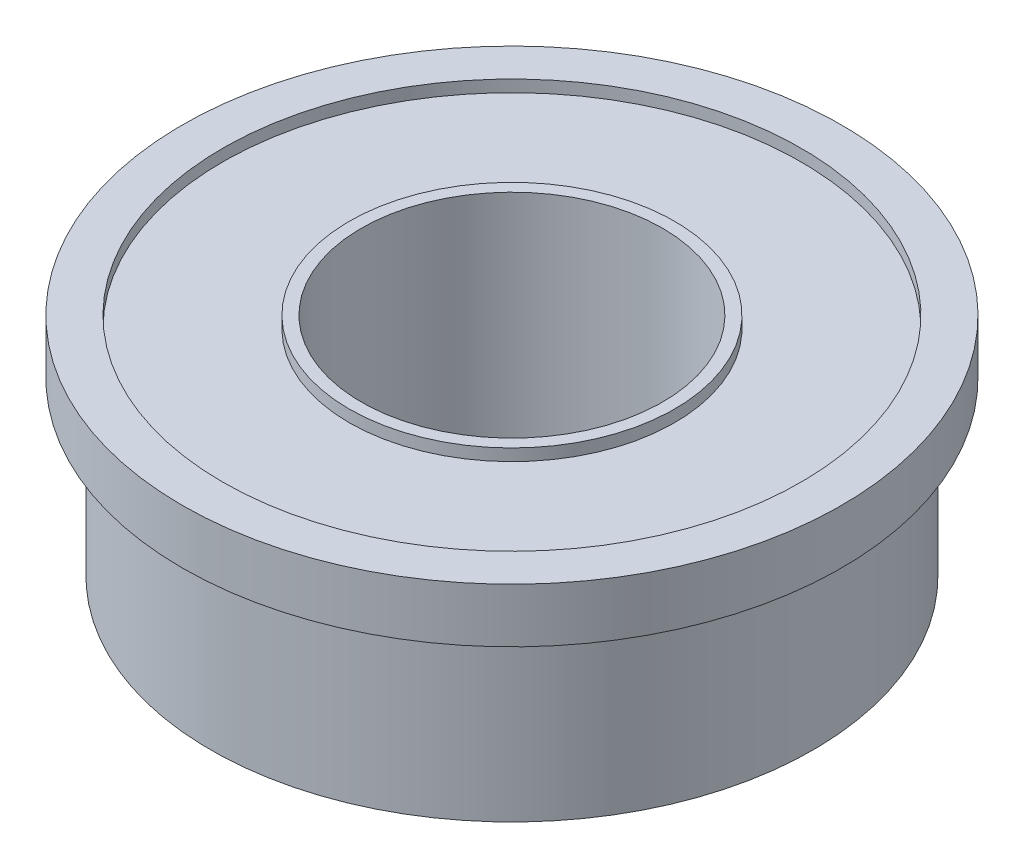
ISO-10303-21;
HEADER;
FILE_DESCRIPTION(('STEP AP214'),'2;1');
FILE_NAME('part.step','',(''),(''),'','','');
FILE_SCHEMA(('AUTOMOTIVE_DESIGN { 1 0 10303 214 1 1 1 1 }'));
ENDSEC;
DATA;
#1=APPLICATION_CONTEXT('core data for automotive mechanical design processes');
#2=APPLICATION_PROTOCOL_DEFINITION('international standard','automotive_design',2000,#1);
#3=PRODUCT_CONTEXT('',#1,'mechanical');
#4=PRODUCT('Part','Part','',(#3));
#5=PRODUCT_RELATED_PRODUCT_CATEGORY('part','',(#4));
#6=PRODUCT_DEFINITION_FORMATION('','',#4);
#7=PRODUCT_DEFINITION_CONTEXT('part definition',#1,'design');
#8=PRODUCT_DEFINITION('design','',#6,#7);
#9=PRODUCT_DEFINITION_SHAPE('','',#8);
#10=(LENGTH_UNIT() NAMED_UNIT(*) SI_UNIT(.MILLI.,.METRE.));
#11=(NAMED_UNIT(*) PLANE_ANGLE_UNIT() SI_UNIT($,.RADIAN.));
#12=(NAMED_UNIT(*) SI_UNIT($,.STERADIAN.) SOLID_ANGLE_UNIT());
#13=UNCERTAINTY_MEASURE_WITH_UNIT(LENGTH_MEASURE(1.E-05),#10,'distance_accuracy_value','');
#14=(GEOMETRIC_REPRESENTATION_CONTEXT(3) GLOBAL_UNCERTAINTY_ASSIGNED_CONTEXT((#13)) GLOBAL_UNIT_ASSIGNED_CONTEXT((#10,
#11,#12)) REPRESENTATION_CONTEXT('',''));
#15=CARTESIAN_POINT('',(0.,0.,0.));
#16=DIRECTION('',(0.,0.,1.));
#17=DIRECTION('',(1.,0.,0.));
#18=AXIS2_PLACEMENT_3D('',#15,#16,#17);
#19=CARTESIAN_POINT('',(0.,4.7625,0.));
#20=DIRECTION('',(0.,-1.,0.));
#21=DIRECTION('',(0.,0.,-1.));
#22=AXIS2_PLACEMENT_3D('',#19,#20,#21);
#23=CYLINDRICAL_SURFACE('',#22,6.35);
#24=CARTESIAN_POINT('',(0.,0.,0.));
#25=DIRECTION('',(0.,1.,0.));
#26=DIRECTION('',(0.,0.,1.));
#27=AXIS2_PLACEMENT_3D('',#24,#25,#26);
#28=CIRCLE('',#27,6.35);
#29=CARTESIAN_POINT('',(0.,0.,-6.35));
#30=VERTEX_POINT('',#29);
#31=EDGE_CURVE('E39',#30,#30,#28,.T.);
#32=CARTESIAN_POINT('',(0.,3.6195,0.));
#33=DIRECTION('',(0.,1.,0.));
#34=DIRECTION('',(0.,0.,1.));
#35=AXIS2_PLACEMENT_3D('',#32,#33,#34);
#36=CIRCLE('',#35,6.35);
#37=CARTESIAN_POINT('',(0.,3.6195,-6.35));
#38=VERTEX_POINT('',#37);
#39=EDGE_CURVE('E10',#38,#38,#36,.T.);
#40=CARTESIAN_POINT('',(0.,0.,-6.35));
#41=CARTESIAN_POINT('',(0.,0.037703125,-6.35));
#42=CARTESIAN_POINT('',(0.,0.07540625,-6.35));
#43=CARTESIAN_POINT('',(0.,0.1508125,-6.35));
#44=CARTESIAN_POINT('',(0.,0.188515625,-6.35));
#45=CARTESIAN_POINT('',(0.,0.263921875,-6.35));
#46=CARTESIAN_POINT('',(0.,0.301625,-6.35));
#47=CARTESIAN_POINT('',(0.,0.37703125,-6.35));
#48=CARTESIAN_POINT('',(0.,0.414734375,-6.35));
#49=CARTESIAN_POINT('',(0.,0.490140625,-6.35));
#50=CARTESIAN_POINT('',(0.,0.52784375,-6.35));
#51=CARTESIAN_POINT('',(0.,0.60325,-6.35));
#52=CARTESIAN_POINT('',(0.,0.640953125,-6.35));
#53=CARTESIAN_POINT('',(0.,0.716359375,-6.35));
#54=CARTESIAN_POINT('',(0.,0.7540625,-6.35));
#55=CARTESIAN_POINT('',(0.,0.82946875,-6.35));
#56=CARTESIAN_POINT('',(0.,0.867171875,-6.35));
#57=CARTESIAN_POINT('',(0.,0.942578125,-6.35));
#58=CARTESIAN_POINT('',(0.,0.98028125,-6.35));
#59=CARTESIAN_POINT('',(0.,1.0556875,-6.35));
#60=CARTESIAN_POINT('',(0.,1.093390625,-6.35));
#61=CARTESIAN_POINT('',(0.,1.168796875,-6.35));
#62=CARTESIAN_POINT('',(0.,1.2065,-6.35));
#63=CARTESIAN_POINT('',(0.,1.28190625,-6.35));
#64=CARTESIAN_POINT('',(0.,1.319609375,-6.35));
#65=CARTESIAN_POINT('',(0.,1.395015625,-6.35));
#66=CARTESIAN_POINT('',(0.,1.43271875,-6.35));
#67=CARTESIAN_POINT('',(0.,1.508125,-6.35));
#68=CARTESIAN_POINT('',(0.,1.545828125,-6.35));
#69=CARTESIAN_POINT('',(0.,1.621234375,-6.35));
#70=CARTESIAN_POINT('',(0.,1.6589375,-6.35));
#71=CARTESIAN_POINT('',(0.,1.73434375,-6.35));
#72=CARTESIAN_POINT('',(0.,1.772046875,-6.35));
#73=CARTESIAN_POINT('',(0.,1.847453125,-6.35));
#74=CARTESIAN_POINT('',(0.,1.88515625,-6.35));
#75=CARTESIAN_POINT('',(0.,1.9605625,-6.35));
#76=CARTESIAN_POINT('',(0.,1.998265625,-6.35));
#77=CARTESIAN_POINT('',(0.,2.073671875,-6.35));
#78=CARTESIAN_POINT('',(0.,2.111375,-6.35));
#79=CARTESIAN_POINT('',(0.,2.18678125,-6.35));
#80=CARTESIAN_POINT('',(0.,2.224484375,-6.35));
#81=CARTESIAN_POINT('',(0.,2.299890625,-6.35));
#82=CARTESIAN_POINT('',(0.,2.33759375,-6.35));
#83=CARTESIAN_POINT('',(0.,2.413,-6.35));
#84=CARTESIAN_POINT('',(0.,2.450703125,-6.35));
#85=CARTESIAN_POINT('',(0.,2.526109375,-6.35));
#86=CARTESIAN_POINT('',(0.,2.5638125,-6.35));
#87=CARTESIAN_POINT('',(0.,2.63921875,-6.35));
#88=CARTESIAN_POINT('',(0.,2.676921875,-6.35));
#89=CARTESIAN_POINT('',(0.,2.752328125,-6.35));
#90=CARTESIAN_POINT('',(0.,2.79003125,-6.35));
#91=CARTESIAN_POINT('',(0.,2.8654375,-6.35));
#92=CARTESIAN_POINT('',(0.,2.903140625,-6.35));
#93=CARTESIAN_POINT('',(0.,2.978546875,-6.35));
#94=CARTESIAN_POINT('',(0.,3.01625,-6.35));
#95=CARTESIAN_POINT('',(0.,3.09165625,-6.35));
#96=CARTESIAN_POINT('',(0.,3.129359375,-6.35));
#97=CARTESIAN_POINT('',(0.,3.204765625,-6.35));
#98=CARTESIAN_POINT('',(0.,3.24246875,-6.35));
#99=CARTESIAN_POINT('',(0.,3.317875,-6.35));
#100=CARTESIAN_POINT('',(0.,3.355578125,-6.35));
#101=CARTESIAN_POINT('',(0.,3.430984375,-6.35));
#102=CARTESIAN_POINT('',(0.,3.4686875,-6.35));
#103=CARTESIAN_POINT('',(0.,3.54409375,-6.35));
#104=CARTESIAN_POINT('',(0.,3.581796875,-6.35));
#105=CARTESIAN_POINT('',(0.,3.6195,-6.35));
#106=B_SPLINE_CURVE_WITH_KNOTS('',3,(#40,#41,#42,#43,#44,#45,#46,#47,#48,#49,#50,#51,#52,#53,
#54,#55,#56,#57,#58,#59,#60,#61,#62,#63,#64,#65,#66,#67,#68,#69,#70,#71,#72,#73,#74,#75,#76,#77,
#78,#79,#80,#81,#82,#83,#84,#85,#86,#87,#88,#89,#90,#91,#92,#93,#94,#95,#96,#97,#98,#99,#100,
#101,#102,#103,#104,#105),.UNSPECIFIED.,.F.,.F.,(4,2,2,2,2,2,2,2,2,2,2,2,2,2,2,2,2,2,2,2,2,2,2,
2,2,2,2,2,2,2,2,2,4),(0.,0.113109375,0.22621875,0.339328125,0.4524375,0.565546875,0.67865625,
0.791765625,0.904875,1.017984375,1.13109375,1.244203125,1.3573125,1.470421875,1.58353125,
1.696640625,1.80975,1.922859375,2.03596875,2.149078125,2.2621875,2.375296875,2.48840625,
2.601515625,2.714625,2.827734375,2.94084375,3.053953125,3.1670625,3.280171875,3.39328125,
3.506390625,3.6195),.UNSPECIFIED.);
#107=EDGE_CURVE('BSEAM33',#30,#38,#106,.T.);
#108=ORIENTED_EDGE('',*,*,#31,.T.);
#109=ORIENTED_EDGE('',*,*,#39,.F.);
#110=ORIENTED_EDGE('',*,*,#107,.T.);
#111=ORIENTED_EDGE('',*,*,#107,.F.);
#112=EDGE_LOOP('',(#108,#110,#109,#111));
#113=FACE_BOUND('',#112,.T.);
#114=ADVANCED_FACE('F33',(#113),#23,.T.);
#115=CARTESIAN_POINT('',(0.,0.,0.));
#116=DIRECTION('',(0.,1.,0.));
#117=DIRECTION('',(0.,0.,1.));
#118=AXIS2_PLACEMENT_3D('',#115,#116,#117);
#119=PLANE('',#118);
#120=CARTESIAN_POINT('',(0.,0.,0.));
#121=DIRECTION('',(0.,1.,0.));
#122=DIRECTION('',(0.,0.,1.));
#123=AXIS2_PLACEMENT_3D('',#120,#121,#122);
#124=CIRCLE('',#123,3.175);
#125=CARTESIAN_POINT('',(0.,0.,-3.175));
#126=VERTEX_POINT('',#125);
#127=EDGE_CURVE('E47',#126,#126,#124,.T.);
#128=ORIENTED_EDGE('',*,*,#127,.T.);
#129=EDGE_LOOP('',(#128));
#130=FACE_BOUND('',#129,.T.);
#131=CARTESIAN_POINT('',(0.,0.,0.));
#132=DIRECTION('',(0.,1.,0.));
#133=DIRECTION('',(0.,0.,1.));
#134=AXIS2_PLACEMENT_3D('',#131,#132,#133);
#135=CIRCLE('',#134,3.429);
#136=CARTESIAN_POINT('',(0.,0.,3.429));
#137=VERTEX_POINT('',#136);
#138=EDGE_CURVE('E71',#137,#137,#135,.T.);
#139=ORIENTED_EDGE('',*,*,#138,.F.);
#140=EDGE_LOOP('',(#139));
#141=FACE_BOUND('',#140,.T.);
#142=ADVANCED_FACE('F95',(#130,#141),#119,.F.);
#143=CARTESIAN_POINT('',(0.,4.7625,0.));
#144=DIRECTION('',(0.,1.,0.));
#145=DIRECTION('',(0.,0.,1.));
#146=AXIS2_PLACEMENT_3D('',#143,#144,#145);
#147=PLANE('',#146);
#148=CARTESIAN_POINT('',(0.,4.7625,0.));
#149=DIRECTION('',(0.,1.,0.));
#150=DIRECTION('',(0.,0.,1.));
#151=AXIS2_PLACEMENT_3D('',#148,#149,#150);
#152=CIRCLE('',#151,3.175);
#153=CARTESIAN_POINT('',(0.,4.7625,-3.175));
#154=VERTEX_POINT('',#153);
#155=EDGE_CURVE('E43',#154,#154,#152,.T.);
#156=ORIENTED_EDGE('',*,*,#155,.F.);
#157=EDGE_LOOP('',(#156));
#158=FACE_BOUND('',#157,.T.);
#159=CARTESIAN_POINT('',(0.,4.7625,0.));
#160=DIRECTION('',(0.,1.,0.));
#161=DIRECTION('',(0.,0.,1.));
#162=AXIS2_PLACEMENT_3D('',#159,#160,#161);
#163=CIRCLE('',#162,3.429);
#164=CARTESIAN_POINT('',(0.,4.7625,3.429));
#165=VERTEX_POINT('',#164);
#166=EDGE_CURVE('E59',#165,#165,#163,.T.);
#167=ORIENTED_EDGE('',*,*,#166,.T.);
#168=EDGE_LOOP('',(#167));
#169=FACE_BOUND('',#168,.T.);
#170=ADVANCED_FACE('F99',(#158,#169),#147,.T.);
#171=CARTESIAN_POINT('',(0.,4.7625,0.));
#172=DIRECTION('',(0.,1.,0.));
#173=DIRECTION('',(0.,0.,1.));
#174=AXIS2_PLACEMENT_3D('',#171,#172,#173);
#175=CIRCLE('',#174,6.096);
#176=CARTESIAN_POINT('',(0.,4.7625,6.096));
#177=VERTEX_POINT('',#176);
#178=EDGE_CURVE('E53',#177,#177,#175,.T.);
#179=ORIENTED_EDGE('',*,*,#178,.F.);
#180=EDGE_LOOP('',(#179));
#181=FACE_BOUND('',#180,.T.);
#182=CARTESIAN_POINT('',(0.,4.7625,0.));
#183=DIRECTION('',(0.,1.,0.));
#184=DIRECTION('',(0.,0.,1.));
#185=AXIS2_PLACEMENT_3D('',#182,#183,#184);
#186=CIRCLE('',#185,6.9469);
#187=CARTESIAN_POINT('',(0.,4.7625,6.9469));
#188=VERTEX_POINT('',#187);
#189=EDGE_CURVE('E77',#188,#188,#186,.T.);
#190=ORIENTED_EDGE('',*,*,#189,.T.);
#191=EDGE_LOOP('',(#190));
#192=FACE_BOUND('',#191,.T.);
#193=ADVANCED_FACE('F106',(#181,#192),#147,.T.);
#194=CARTESIAN_POINT('',(0.,0.,0.));
#195=DIRECTION('',(0.,1.,0.));
#196=DIRECTION('',(0.,0.,1.));
#197=AXIS2_PLACEMENT_3D('',#194,#195,#196);
#198=CIRCLE('',#197,6.096);
#199=CARTESIAN_POINT('',(0.,0.,6.096));
#200=VERTEX_POINT('',#199);
#201=EDGE_CURVE('E65',#200,#200,#198,.T.);
#202=ORIENTED_EDGE('',*,*,#201,.T.);
#203=EDGE_LOOP('',(#202));
#204=FACE_BOUND('',#203,.T.);
#205=ORIENTED_EDGE('',*,*,#31,.F.);
#206=EDGE_LOOP('',(#205));
#207=FACE_BOUND('',#206,.T.);
#208=ADVANCED_FACE('F101',(#204,#207),#119,.F.);
#209=CARTESIAN_POINT('',(0.,4.7625,0.));
#210=DIRECTION('',(0.,-1.,0.));
#211=DIRECTION('',(0.,0.,-1.));
#212=AXIS2_PLACEMENT_3D('',#209,#210,#211);
#213=CYLINDRICAL_SURFACE('',#212,3.175);
#214=CARTESIAN_POINT('',(0.,4.7625,-3.175));
#215=CARTESIAN_POINT('',(0.,4.712890625,-3.175));
#216=CARTESIAN_POINT('',(0.,4.66328125,-3.175));
#217=CARTESIAN_POINT('',(0.,4.5640625,-3.175));
#218=CARTESIAN_POINT('',(0.,4.514453125,-3.175));
#219=CARTESIAN_POINT('',(0.,4.415234375,-3.175));
#220=CARTESIAN_POINT('',(0.,4.365625,-3.175));
#221=CARTESIAN_POINT('',(0.,4.26640625,-3.175));
#222=CARTESIAN_POINT('',(0.,4.216796875,-3.175));
#223=CARTESIAN_POINT('',(0.,4.117578125,-3.175));
#224=CARTESIAN_POINT('',(0.,4.06796875,-3.175));
#225=CARTESIAN_POINT('',(0.,3.96875,-3.175));
#226=CARTESIAN_POINT('',(0.,3.919140625,-3.175));
#227=CARTESIAN_POINT('',(0.,3.819921875,-3.175));
#228=CARTESIAN_POINT('',(0.,3.7703125,-3.175));
#229=CARTESIAN_POINT('',(0.,3.67109375,-3.175));
#230=CARTESIAN_POINT('',(0.,3.621484375,-3.175));
#231=CARTESIAN_POINT('',(0.,3.522265625,-3.175));
#232=CARTESIAN_POINT('',(0.,3.47265625,-3.175));
#233=CARTESIAN_POINT('',(0.,3.3734375,-3.175));
#234=CARTESIAN_POINT('',(0.,3.323828125,-3.175));
#235=CARTESIAN_POINT('',(0.,3.224609375,-3.175));
#236=CARTESIAN_POINT('',(0.,3.175,-3.175));
#237=CARTESIAN_POINT('',(0.,3.07578125,-3.175));
#238=CARTESIAN_POINT('',(0.,3.026171875,-3.175));
#239=CARTESIAN_POINT('',(0.,2.926953125,-3.175));
#240=CARTESIAN_POINT('',(0.,2.87734375,-3.175));
#241=CARTESIAN_POINT('',(0.,2.778125,-3.175));
#242=CARTESIAN_POINT('',(0.,2.728515625,-3.175));
#243=CARTESIAN_POINT('',(0.,2.629296875,-3.175));
#244=CARTESIAN_POINT('',(0.,2.5796875,-3.175));
#245=CARTESIAN_POINT('',(0.,2.48046875,-3.175));
#246=CARTESIAN_POINT('',(0.,2.430859375,-3.175));
#247=CARTESIAN_POINT('',(0.,2.331640625,-3.175));
#248=CARTESIAN_POINT('',(0.,2.28203125,-3.175));
#249=CARTESIAN_POINT('',(0.,2.1828125,-3.175));
#250=CARTESIAN_POINT('',(0.,2.133203125,-3.175));
#251=CARTESIAN_POINT('',(0.,2.033984375,-3.175));
#252=CARTESIAN_POINT('',(0.,1.984375,-3.175));
#253=CARTESIAN_POINT('',(0.,1.88515625,-3.175));
#254=CARTESIAN_POINT('',(0.,1.835546875,-3.175));
#255=CARTESIAN_POINT('',(0.,1.736328125,-3.175));
#256=CARTESIAN_POINT('',(0.,1.68671875,-3.175));
#257=CARTESIAN_POINT('',(0.,1.5875,-3.175));
#258=CARTESIAN_POINT('',(0.,1.537890625,-3.175));
#259=CARTESIAN_POINT('',(0.,1.438671875,-3.175));
#260=CARTESIAN_POINT('',(0.,1.3890625,-3.175));
#261=CARTESIAN_POINT('',(0.,1.28984375,-3.175));
#262=CARTESIAN_POINT('',(0.,1.240234375,-3.175));
#263=CARTESIAN_POINT('',(0.,1.141015625,-3.175));
#264=CARTESIAN_POINT('',(0.,1.09140625,-3.175));
#265=CARTESIAN_POINT('',(0.,0.9921875,-3.175));
#266=CARTESIAN_POINT('',(0.,0.942578125,-3.175));
#267=CARTESIAN_POINT('',(0.,0.843359375,-3.175));
#268=CARTESIAN_POINT('',(0.,0.79375,-3.175));
#269=CARTESIAN_POINT('',(0.,0.69453125,-3.175));
#270=CARTESIAN_POINT('',(0.,0.644921875,-3.175));
#271=CARTESIAN_POINT('',(0.,0.545703125,-3.175));
#272=CARTESIAN_POINT('',(0.,0.49609375,-3.175));
#273=CARTESIAN_POINT('',(0.,0.396875,-3.175));
#274=CARTESIAN_POINT('',(0.,0.347265625,-3.175));
#275=CARTESIAN_POINT('',(0.,0.248046875,-3.175));
#276=CARTESIAN_POINT('',(0.,0.1984375,-3.175));
#277=CARTESIAN_POINT('',(0.,0.09921875,-3.175));
#278=CARTESIAN_POINT('',(0.,0.049609375,-3.175));
#279=CARTESIAN_POINT('',(0.,0.,-3.175));
#280=B_SPLINE_CURVE_WITH_KNOTS('',3,(#214,#215,#216,#217,#218,#219,#220,#221,#222,#223,#224,
#225,#226,#227,#228,#229,#230,#231,#232,#233,#234,#235,#236,#237,#238,#239,#240,#241,#242,#243,
#244,#245,#246,#247,#248,#249,#250,#251,#252,#253,#254,#255,#256,#257,#258,#259,#260,#261,#262,
#263,#264,#265,#266,#267,#268,#269,#270,#271,#272,#273,#274,#275,#276,#277,#278,#279),
.UNSPECIFIED.,.F.,.F.,(4,2,2,2,2,2,2,2,2,2,2,2,2,2,2,2,2,2,2,2,2,2,2,2,2,2,2,2,2,2,2,2,4),(0.,
0.148828124999999,0.297656249999999,0.446484374999999,0.595312499999999,0.744140625,0.89296875,
1.041796875,1.190625,1.339453125,1.48828125,1.637109375,1.7859375,1.934765625,2.08359375,
2.232421875,2.38125,2.530078125,2.67890625,2.827734375,2.9765625,3.125390625,3.27421875,
3.423046875,3.571875,3.720703125,3.86953125,4.018359375,4.1671875,4.316015625,4.46484375,
4.613671875,4.7625),.UNSPECIFIED.);
#281=EDGE_CURVE('BSEAM111',#154,#126,#280,.T.);
#282=ORIENTED_EDGE('',*,*,#155,.T.);
#283=ORIENTED_EDGE('',*,*,#127,.F.);
#284=ORIENTED_EDGE('',*,*,#281,.T.);
#285=ORIENTED_EDGE('',*,*,#281,.F.);
#286=EDGE_LOOP('',(#282,#284,#283,#285));
#287=FACE_BOUND('',#286,.T.);
#288=ADVANCED_FACE('F111',(#287),#213,.F.);
#289=CARTESIAN_POINT('',(0.,4.5125,0.));
#290=DIRECTION('',(0.,1.,0.));
#291=DIRECTION('',(0.,0.,1.));
#292=AXIS2_PLACEMENT_3D('',#289,#290,#291);
#293=CYLINDRICAL_SURFACE('',#292,6.096);
#294=CARTESIAN_POINT('',(0.,4.5125,0.));
#295=DIRECTION('',(0.,1.,0.));
#296=DIRECTION('',(0.,0.,1.));
#297=AXIS2_PLACEMENT_3D('',#294,#295,#296);
#298=CIRCLE('',#297,6.096);
#299=CARTESIAN_POINT('',(0.,4.5125,6.096));
#300=VERTEX_POINT('',#299);
#301=EDGE_CURVE('E51',#300,#300,#298,.T.);
#302=ORIENTED_EDGE('',*,*,#301,.F.);
#303=EDGE_LOOP('',(#302));
#304=FACE_BOUND('',#303,.T.);
#305=ORIENTED_EDGE('',*,*,#178,.T.);
#306=EDGE_LOOP('',(#305));
#307=FACE_BOUND('',#306,.T.);
#308=ADVANCED_FACE('F117',(#304,#307),#293,.F.);
#309=CARTESIAN_POINT('',(0.,4.5125,0.));
#310=DIRECTION('',(0.,1.,0.));
#311=DIRECTION('',(0.,0.,1.));
#312=AXIS2_PLACEMENT_3D('',#309,#310,#311);
#313=PLANE('',#312);
#314=CARTESIAN_POINT('',(0.,4.5125,0.));
#315=DIRECTION('',(0.,1.,0.));
#316=DIRECTION('',(0.,0.,1.));
#317=AXIS2_PLACEMENT_3D('',#314,#315,#316);
#318=CIRCLE('',#317,3.429);
#319=CARTESIAN_POINT('',(0.,4.5125,3.429));
#320=VERTEX_POINT('',#319);
#321=EDGE_CURVE('E56',#320,#320,#318,.T.);
#322=ORIENTED_EDGE('',*,*,#321,.F.);
#323=EDGE_LOOP('',(#322));
#324=FACE_BOUND('',#323,.T.);
#325=ORIENTED_EDGE('',*,*,#301,.T.);
#326=EDGE_LOOP('',(#325));
#327=FACE_BOUND('',#326,.T.);
#328=ADVANCED_FACE('F141',(#324,#327),#313,.T.);
#329=CARTESIAN_POINT('',(0.,4.5125,0.));
#330=DIRECTION('',(0.,1.,0.));
#331=DIRECTION('',(0.,0.,1.));
#332=AXIS2_PLACEMENT_3D('',#329,#330,#331);
#333=CYLINDRICAL_SURFACE('',#332,3.429);
#334=ORIENTED_EDGE('',*,*,#321,.T.);
#335=EDGE_LOOP('',(#334));
#336=FACE_BOUND('',#335,.T.);
#337=ORIENTED_EDGE('',*,*,#166,.F.);
#338=EDGE_LOOP('',(#337));
#339=FACE_BOUND('',#338,.T.);
#340=ADVANCED_FACE('F135',(#336,#339),#333,.T.);
#341=CARTESIAN_POINT('',(0.,0.25,0.));
#342=DIRECTION('',(0.,-1.,0.));
#343=DIRECTION('',(0.,0.,1.));
#344=AXIS2_PLACEMENT_3D('',#341,#342,#343);
#345=PLANE('',#344);
#346=CARTESIAN_POINT('',(0.,0.25,0.));
#347=DIRECTION('',(0.,1.,0.));
#348=DIRECTION('',(0.,0.,1.));
#349=AXIS2_PLACEMENT_3D('',#346,#347,#348);
#350=CIRCLE('',#349,6.096);
#351=CARTESIAN_POINT('',(0.,0.25,6.096));
#352=VERTEX_POINT('',#351);
#353=EDGE_CURVE('E62',#352,#352,#350,.T.);
#354=ORIENTED_EDGE('',*,*,#353,.F.);
#355=EDGE_LOOP('',(#354));
#356=FACE_BOUND('',#355,.T.);
#357=CARTESIAN_POINT('',(0.,0.25,0.));
#358=DIRECTION('',(0.,1.,0.));
#359=DIRECTION('',(0.,0.,1.));
#360=AXIS2_PLACEMENT_3D('',#357,#358,#359);
#361=CIRCLE('',#360,3.429);
#362=CARTESIAN_POINT('',(0.,0.25,3.429));
#363=VERTEX_POINT('',#362);
#364=EDGE_CURVE('E68',#363,#363,#361,.T.);
#365=ORIENTED_EDGE('',*,*,#364,.T.);
#366=EDGE_LOOP('',(#365));
#367=FACE_BOUND('',#366,.T.);
#368=ADVANCED_FACE('F126',(#356,#367),#345,.T.);
#369=CARTESIAN_POINT('',(0.,0.25,0.));
#370=DIRECTION('',(0.,-1.,0.));
#371=DIRECTION('',(0.,0.,-1.));
#372=AXIS2_PLACEMENT_3D('',#369,#370,#371);
#373=CYLINDRICAL_SURFACE('',#372,6.096);
#374=ORIENTED_EDGE('',*,*,#353,.T.);
#375=EDGE_LOOP('',(#374));
#376=FACE_BOUND('',#375,.T.);
#377=ORIENTED_EDGE('',*,*,#201,.F.);
#378=EDGE_LOOP('',(#377));
#379=FACE_BOUND('',#378,.T.);
#380=ADVANCED_FACE('F124',(#376,#379),#373,.F.);
#381=CARTESIAN_POINT('',(0.,0.25,0.));
#382=DIRECTION('',(0.,-1.,0.));
#383=DIRECTION('',(0.,0.,-1.));
#384=AXIS2_PLACEMENT_3D('',#381,#382,#383);
#385=CYLINDRICAL_SURFACE('',#384,3.429);
#386=ORIENTED_EDGE('',*,*,#364,.F.);
#387=EDGE_LOOP('',(#386));
#388=FACE_BOUND('',#387,.T.);
#389=ORIENTED_EDGE('',*,*,#138,.T.);
#390=EDGE_LOOP('',(#389));
#391=FACE_BOUND('',#390,.T.);
#392=ADVANCED_FACE('F92',(#388,#391),#385,.T.);
#393=CARTESIAN_POINT('',(0.,3.6195,0.));
#394=DIRECTION('',(0.,1.,0.));
#395=DIRECTION('',(0.,0.,1.));
#396=AXIS2_PLACEMENT_3D('',#393,#394,#395);
#397=CYLINDRICAL_SURFACE('',#396,6.9469);
#398=CARTESIAN_POINT('',(0.,3.6195,0.));
#399=DIRECTION('',(0.,1.,0.));
#400=DIRECTION('',(0.,0.,1.));
#401=AXIS2_PLACEMENT_3D('',#398,#399,#400);
#402=CIRCLE('',#401,6.9469);
#403=CARTESIAN_POINT('',(0.,3.6195,6.9469));
#404=VERTEX_POINT('',#403);
#405=EDGE_CURVE('E74',#404,#404,#402,.T.);
#406=ORIENTED_EDGE('',*,*,#405,.T.);
#407=EDGE_LOOP('',(#406));
#408=FACE_BOUND('',#407,.T.);
#409=ORIENTED_EDGE('',*,*,#189,.F.);
#410=EDGE_LOOP('',(#409));
#411=FACE_BOUND('',#410,.T.);
#412=ADVANCED_FACE('F83',(#408,#411),#397,.T.);
#413=CARTESIAN_POINT('',(0.,3.6195,0.));
#414=DIRECTION('',(0.,1.,0.));
#415=DIRECTION('',(0.,0.,1.));
#416=AXIS2_PLACEMENT_3D('',#413,#414,#415);
#417=PLANE('',#416);
#418=ORIENTED_EDGE('',*,*,#39,.T.);
#419=EDGE_LOOP('',(#418));
#420=FACE_BOUND('',#419,.T.);
#421=ORIENTED_EDGE('',*,*,#405,.F.);
#422=EDGE_LOOP('',(#421));
#423=FACE_BOUND('',#422,.T.);
#424=ADVANCED_FACE('F86',(#420,#423),#417,.F.);
#425=CLOSED_SHELL('',(#114,#142,#170,#193,#208,#288,#308,#328,#340,#368,#380,#392,#412,#424));
#426=MANIFOLD_SOLID_BREP('B2',#425);
#427=ADVANCED_BREP_SHAPE_REPRESENTATION('',(#18,#426),#14);
#428=SHAPE_DEFINITION_REPRESENTATION(#9,#427);
ENDSEC;
END-ISO-10303-21;
